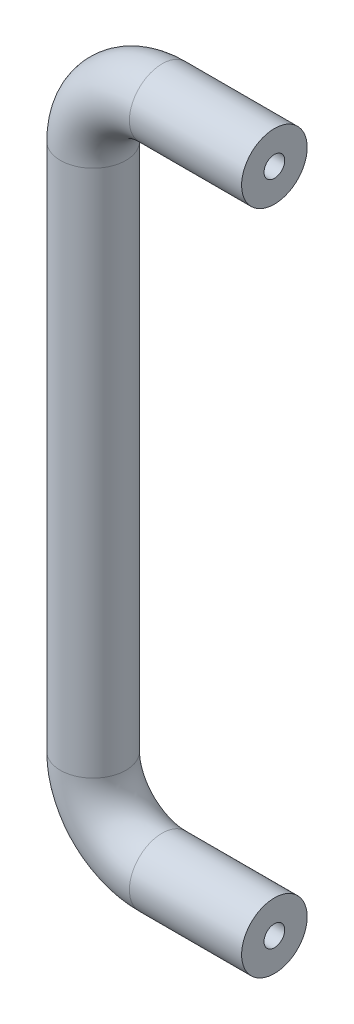
ISO-10303-21;
HEADER;
FILE_DESCRIPTION(('STEP AP214'),'2;1');
FILE_NAME('part.step','',(''),(''),'','','');
FILE_SCHEMA(('AUTOMOTIVE_DESIGN { 1 0 10303 214 1 1 1 1 }'));
ENDSEC;
DATA;
#1=APPLICATION_CONTEXT('core data for automotive mechanical design processes');
#2=APPLICATION_PROTOCOL_DEFINITION('international standard','automotive_design',2000,#1);
#3=PRODUCT_CONTEXT('',#1,'mechanical');
#4=PRODUCT('Part','Part','',(#3));
#5=PRODUCT_RELATED_PRODUCT_CATEGORY('part','',(#4));
#6=PRODUCT_DEFINITION_FORMATION('','',#4);
#7=PRODUCT_DEFINITION_CONTEXT('part definition',#1,'design');
#8=PRODUCT_DEFINITION('design','',#6,#7);
#9=PRODUCT_DEFINITION_SHAPE('','',#8);
#10=(LENGTH_UNIT() NAMED_UNIT(*) SI_UNIT(.MILLI.,.METRE.));
#11=(NAMED_UNIT(*) PLANE_ANGLE_UNIT() SI_UNIT($,.RADIAN.));
#12=(NAMED_UNIT(*) SI_UNIT($,.STERADIAN.) SOLID_ANGLE_UNIT());
#13=UNCERTAINTY_MEASURE_WITH_UNIT(LENGTH_MEASURE(1.E-05),#10,'distance_accuracy_value','');
#14=(GEOMETRIC_REPRESENTATION_CONTEXT(3) GLOBAL_UNCERTAINTY_ASSIGNED_CONTEXT((#13)) GLOBAL_UNIT_ASSIGNED_CONTEXT((#10,
#11,#12)) REPRESENTATION_CONTEXT('',''));
#15=CARTESIAN_POINT('',(0.,0.,0.));
#16=DIRECTION('',(0.,0.,1.));
#17=DIRECTION('',(1.,0.,0.));
#18=AXIS2_PLACEMENT_3D('',#15,#16,#17);
#19=CARTESIAN_POINT('',(0.,0.,0.));
#20=DIRECTION('',(1.,0.,0.));
#21=DIRECTION('',(0.,0.,-1.));
#22=AXIS2_PLACEMENT_3D('',#19,#20,#21);
#23=PLANE('',#22);
#24=CARTESIAN_POINT('',(0.,0.,0.));
#25=DIRECTION('',(1.,0.,0.));
#26=DIRECTION('',(0.,0.,-1.));
#27=AXIS2_PLACEMENT_3D('',#24,#25,#26);
#28=CIRCLE('',#27,1.5);
#29=CARTESIAN_POINT('',(0.,0.,-1.5));
#30=VERTEX_POINT('',#29);
#31=EDGE_CURVE('E113',#30,#30,#28,.T.);
#32=ORIENTED_EDGE('',*,*,#31,.F.);
#33=EDGE_LOOP('',(#32));
#34=FACE_BOUND('',#33,.T.);
#35=CARTESIAN_POINT('',(0.,0.,0.));
#36=DIRECTION('',(1.,0.,0.));
#37=DIRECTION('',(0.,0.,-1.));
#38=AXIS2_PLACEMENT_3D('',#35,#36,#37);
#39=CIRCLE('',#38,4.75);
#40=CARTESIAN_POINT('',(0.,0.,-4.75));
#41=VERTEX_POINT('',#40);
#42=EDGE_CURVE('E58',#41,#41,#39,.T.);
#43=ORIENTED_EDGE('',*,*,#42,.T.);
#44=EDGE_LOOP('',(#43));
#45=FACE_BOUND('',#44,.T.);
#46=ADVANCED_FACE('F46',(#34,#45),#23,.T.);
#47=CARTESIAN_POINT('',(0.,-96.5,0.));
#48=DIRECTION('',(-1.,0.,0.));
#49=DIRECTION('',(0.,0.,-1.));
#50=AXIS2_PLACEMENT_3D('',#47,#48,#49);
#51=PLANE('',#50);
#52=CARTESIAN_POINT('',(0.,-96.5,0.));
#53=DIRECTION('',(1.,0.,0.));
#54=DIRECTION('',(0.,0.,-1.));
#55=AXIS2_PLACEMENT_3D('',#52,#53,#54);
#56=CIRCLE('',#55,1.5);
#57=CARTESIAN_POINT('',(0.,-96.5,-1.5));
#58=VERTEX_POINT('',#57);
#59=EDGE_CURVE('E123',#58,#58,#56,.T.);
#60=ORIENTED_EDGE('',*,*,#59,.F.);
#61=EDGE_LOOP('',(#60));
#62=FACE_BOUND('',#61,.T.);
#63=CARTESIAN_POINT('',(0.,-96.5,0.));
#64=DIRECTION('',(-1.,0.,0.));
#65=DIRECTION('',(0.,0.,-1.));
#66=AXIS2_PLACEMENT_3D('',#63,#64,#65);
#67=CIRCLE('',#66,4.75);
#68=CARTESIAN_POINT('',(0.,-96.5,-4.75));
#69=VERTEX_POINT('',#68);
#70=EDGE_CURVE('E13',#69,#69,#67,.T.);
#71=ORIENTED_EDGE('',*,*,#70,.F.);
#72=EDGE_LOOP('',(#71));
#73=FACE_BOUND('',#72,.T.);
#74=ADVANCED_FACE('F64',(#62,#73),#51,.F.);
#75=CARTESIAN_POINT('',(0.,0.,0.));
#76=DIRECTION('',(-1.,0.,0.));
#77=DIRECTION('',(0.,0.,1.));
#78=AXIS2_PLACEMENT_3D('',#75,#76,#77);
#79=CYLINDRICAL_SURFACE('',#78,4.75);
#80=CARTESIAN_POINT('',(-16.2499999999999,0.,0.));
#81=DIRECTION('',(1.,0.,0.));
#82=DIRECTION('',(0.,0.,-1.));
#83=AXIS2_PLACEMENT_3D('',#80,#81,#82);
#84=CIRCLE('',#83,4.75);
#85=CARTESIAN_POINT('',(-16.2499999999999,4.75,0.));
#86=VERTEX_POINT('',#85);
#87=EDGE_CURVE('E115',#86,#86,#84,.T.);
#88=ORIENTED_EDGE('',*,*,#87,.T.);
#89=EDGE_LOOP('',(#88));
#90=FACE_BOUND('',#89,.T.);
#91=ORIENTED_EDGE('',*,*,#42,.F.);
#92=EDGE_LOOP('',(#91));
#93=FACE_BOUND('',#92,.T.);
#94=ADVANCED_FACE('F66',(#90,#93),#79,.T.);
#95=CARTESIAN_POINT('',(-16.25,-10.,0.));
#96=DIRECTION('',(0.,0.,1.));
#97=DIRECTION('',(1.,0.,0.));
#98=AXIS2_PLACEMENT_3D('',#95,#96,#97);
#99=TOROIDAL_SURFACE('',#98,10.,4.75);
#100=CARTESIAN_POINT('',(-26.25,-10.0000000000001,0.));
#101=DIRECTION('',(0.,1.,0.));
#102=DIRECTION('',(0.,0.,-1.));
#103=AXIS2_PLACEMENT_3D('',#100,#101,#102);
#104=CIRCLE('',#103,4.75);
#105=CARTESIAN_POINT('',(-31.,-10.0000000000001,0.));
#106=VERTEX_POINT('',#105);
#107=EDGE_CURVE('E128',#106,#106,#104,.T.);
#108=CARTESIAN_POINT('',(-16.25,-10.,0.));
#109=DIRECTION('',(0.,0.,1.));
#110=DIRECTION('',(1.,0.,0.));
#111=AXIS2_PLACEMENT_3D('',#108,#109,#110);
#112=CIRCLE('',#111,14.75);
#113=EDGE_CURVE('',#86,#106,#112,.T.);
#114=ORIENTED_EDGE('',*,*,#87,.F.);
#115=ORIENTED_EDGE('',*,*,#107,.T.);
#116=ORIENTED_EDGE('',*,*,#113,.T.);
#117=ORIENTED_EDGE('',*,*,#113,.F.);
#118=EDGE_LOOP('',(#114,#116,#115,#117));
#119=FACE_BOUND('',#118,.T.);
#120=ADVANCED_FACE('F72',(#119),#99,.T.);
#121=CARTESIAN_POINT('',(-26.25,-10.0000000000001,0.));
#122=DIRECTION('',(0.,-1.,0.));
#123=DIRECTION('',(1.,0.,0.));
#124=AXIS2_PLACEMENT_3D('',#121,#122,#123);
#125=CYLINDRICAL_SURFACE('',#124,4.75);
#126=CARTESIAN_POINT('',(-26.25,-86.4999999999999,0.));
#127=DIRECTION('',(0.,1.,0.));
#128=DIRECTION('',(0.,0.,-1.));
#129=AXIS2_PLACEMENT_3D('',#126,#127,#128);
#130=CIRCLE('',#129,4.75);
#131=CARTESIAN_POINT('',(-31.,-86.4999999999999,0.));
#132=VERTEX_POINT('',#131);
#133=EDGE_CURVE('E131',#132,#132,#130,.T.);
#134=ORIENTED_EDGE('',*,*,#133,.T.);
#135=EDGE_LOOP('',(#134));
#136=FACE_BOUND('',#135,.T.);
#137=ORIENTED_EDGE('',*,*,#107,.F.);
#138=EDGE_LOOP('',(#137));
#139=FACE_BOUND('',#138,.T.);
#140=ADVANCED_FACE('F88',(#136,#139),#125,.T.);
#141=CARTESIAN_POINT('',(-16.25,-86.5,0.));
#142=DIRECTION('',(0.,0.,1.));
#143=DIRECTION('',(1.,0.,0.));
#144=AXIS2_PLACEMENT_3D('',#141,#142,#143);
#145=TOROIDAL_SURFACE('',#144,9.99999999999999,4.75);
#146=CARTESIAN_POINT('',(-16.2499999999999,-96.5,0.));
#147=DIRECTION('',(-1.,0.,0.));
#148=DIRECTION('',(0.,0.,-1.));
#149=AXIS2_PLACEMENT_3D('',#146,#147,#148);
#150=CIRCLE('',#149,4.75);
#151=CARTESIAN_POINT('',(-16.2499999999999,-101.25,0.));
#152=VERTEX_POINT('',#151);
#153=EDGE_CURVE('E53',#152,#152,#150,.T.);
#154=CARTESIAN_POINT('',(-16.25,-86.5,0.));
#155=DIRECTION('',(0.,0.,1.));
#156=DIRECTION('',(1.,0.,0.));
#157=AXIS2_PLACEMENT_3D('',#154,#155,#156);
#158=CIRCLE('',#157,14.75);
#159=EDGE_CURVE('',#132,#152,#158,.T.);
#160=ORIENTED_EDGE('',*,*,#133,.F.);
#161=ORIENTED_EDGE('',*,*,#153,.T.);
#162=ORIENTED_EDGE('',*,*,#159,.T.);
#163=ORIENTED_EDGE('',*,*,#159,.F.);
#164=EDGE_LOOP('',(#160,#162,#161,#163));
#165=FACE_BOUND('',#164,.T.);
#166=ADVANCED_FACE('F80',(#165),#145,.T.);
#167=CARTESIAN_POINT('',(-16.2499999999999,-96.5,0.));
#168=DIRECTION('',(1.,0.,0.));
#169=DIRECTION('',(0.,0.,-1.));
#170=AXIS2_PLACEMENT_3D('',#167,#168,#169);
#171=CYLINDRICAL_SURFACE('',#170,4.75);
#172=ORIENTED_EDGE('',*,*,#70,.T.);
#173=EDGE_LOOP('',(#172));
#174=FACE_BOUND('',#173,.T.);
#175=ORIENTED_EDGE('',*,*,#153,.F.);
#176=EDGE_LOOP('',(#175));
#177=FACE_BOUND('',#176,.T.);
#178=ADVANCED_FACE('F61',(#174,#177),#171,.T.);
#179=CARTESIAN_POINT('',(-10.,-96.5,0.));
#180=DIRECTION('',(1.,0.,0.));
#181=DIRECTION('',(0.,0.,-1.));
#182=AXIS2_PLACEMENT_3D('',#179,#180,#181);
#183=CYLINDRICAL_SURFACE('',#182,1.5);
#184=CARTESIAN_POINT('',(-10.,-96.5,0.));
#185=DIRECTION('',(1.,0.,0.));
#186=DIRECTION('',(0.,0.,-1.));
#187=AXIS2_PLACEMENT_3D('',#184,#185,#186);
#188=CIRCLE('',#187,1.5);
#189=CARTESIAN_POINT('',(-10.,-96.5,-1.5));
#190=VERTEX_POINT('',#189);
#191=EDGE_CURVE('E118',#190,#190,#188,.T.);
#192=ORIENTED_EDGE('',*,*,#191,.F.);
#193=EDGE_LOOP('',(#192));
#194=FACE_BOUND('',#193,.T.);
#195=ORIENTED_EDGE('',*,*,#59,.T.);
#196=EDGE_LOOP('',(#195));
#197=FACE_BOUND('',#196,.T.);
#198=ADVANCED_FACE('F76',(#194,#197),#183,.F.);
#199=CARTESIAN_POINT('',(-10.,-96.5,0.));
#200=DIRECTION('',(1.,0.,0.));
#201=DIRECTION('',(0.,0.,-1.));
#202=AXIS2_PLACEMENT_3D('',#199,#200,#201);
#203=PLANE('',#202);
#204=ORIENTED_EDGE('',*,*,#191,.T.);
#205=EDGE_LOOP('',(#204));
#206=FACE_BOUND('',#205,.T.);
#207=ADVANCED_FACE('F85',(#206),#203,.T.);
#208=CARTESIAN_POINT('',(-10.,0.,0.));
#209=DIRECTION('',(1.,0.,0.));
#210=DIRECTION('',(0.,0.,-1.));
#211=AXIS2_PLACEMENT_3D('',#208,#209,#210);
#212=CYLINDRICAL_SURFACE('',#211,1.5);
#213=CARTESIAN_POINT('',(-10.,0.,0.));
#214=DIRECTION('',(1.,0.,0.));
#215=DIRECTION('',(0.,0.,-1.));
#216=AXIS2_PLACEMENT_3D('',#213,#214,#215);
#217=CIRCLE('',#216,1.5);
#218=CARTESIAN_POINT('',(-10.,0.,-1.5));
#219=VERTEX_POINT('',#218);
#220=EDGE_CURVE('E112',#219,#219,#217,.T.);
#221=ORIENTED_EDGE('',*,*,#220,.F.);
#222=EDGE_LOOP('',(#221));
#223=FACE_BOUND('',#222,.T.);
#224=ORIENTED_EDGE('',*,*,#31,.T.);
#225=EDGE_LOOP('',(#224));
#226=FACE_BOUND('',#225,.T.);
#227=ADVANCED_FACE('F100',(#223,#226),#212,.F.);
#228=CARTESIAN_POINT('',(-10.,0.,0.));
#229=DIRECTION('',(1.,0.,0.));
#230=DIRECTION('',(0.,0.,-1.));
#231=AXIS2_PLACEMENT_3D('',#228,#229,#230);
#232=PLANE('',#231);
#233=ORIENTED_EDGE('',*,*,#220,.T.);
#234=EDGE_LOOP('',(#233));
#235=FACE_BOUND('',#234,.T.);
#236=ADVANCED_FACE('F104',(#235),#232,.T.);
#237=CLOSED_SHELL('',(#46,#74,#94,#120,#140,#166,#178,#198,#207,#227,#236));
#238=MANIFOLD_SOLID_BREP('B2',#237);
#239=ADVANCED_BREP_SHAPE_REPRESENTATION('',(#18,#238),#14);
#240=SHAPE_DEFINITION_REPRESENTATION(#9,#239);
ENDSEC;
END-ISO-10303-21;
